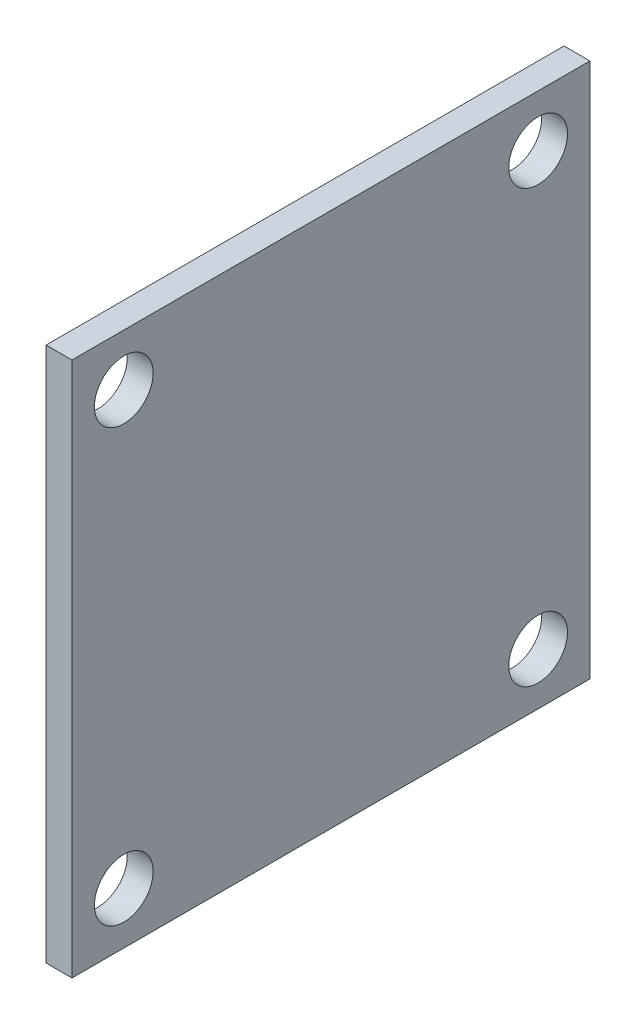
ISO-10303-21;
HEADER;
FILE_DESCRIPTION(('STEP AP214'),'2;1');
FILE_NAME('part.step','',(''),(''),'','','');
FILE_SCHEMA(('AUTOMOTIVE_DESIGN { 1 0 10303 214 1 1 1 1 }'));
ENDSEC;
DATA;
#1=APPLICATION_CONTEXT('core data for automotive mechanical design processes');
#2=APPLICATION_PROTOCOL_DEFINITION('international standard','automotive_design',2000,#1);
#3=PRODUCT_CONTEXT('',#1,'mechanical');
#4=PRODUCT('Part','Part','',(#3));
#5=PRODUCT_RELATED_PRODUCT_CATEGORY('part','',(#4));
#6=PRODUCT_DEFINITION_FORMATION('','',#4);
#7=PRODUCT_DEFINITION_CONTEXT('part definition',#1,'design');
#8=PRODUCT_DEFINITION('design','',#6,#7);
#9=PRODUCT_DEFINITION_SHAPE('','',#8);
#10=(LENGTH_UNIT() NAMED_UNIT(*) SI_UNIT(.MILLI.,.METRE.));
#11=(NAMED_UNIT(*) PLANE_ANGLE_UNIT() SI_UNIT($,.RADIAN.));
#12=(NAMED_UNIT(*) SI_UNIT($,.STERADIAN.) SOLID_ANGLE_UNIT());
#13=UNCERTAINTY_MEASURE_WITH_UNIT(LENGTH_MEASURE(1.E-05),#10,'distance_accuracy_value','');
#14=(GEOMETRIC_REPRESENTATION_CONTEXT(3) GLOBAL_UNCERTAINTY_ASSIGNED_CONTEXT((#13)) GLOBAL_UNIT_ASSIGNED_CONTEXT((#10,
#11,#12)) REPRESENTATION_CONTEXT('',''));
#15=CARTESIAN_POINT('',(0.,0.,0.));
#16=DIRECTION('',(0.,0.,1.));
#17=DIRECTION('',(1.,0.,0.));
#18=AXIS2_PLACEMENT_3D('',#15,#16,#17);
#19=CARTESIAN_POINT('',(-1.5,-15.5,-15.));
#20=DIRECTION('',(0.,0.,-1.));
#21=DIRECTION('',(-1.,0.,0.));
#22=AXIS2_PLACEMENT_3D('',#19,#20,#21);
#23=PLANE('',#22);
#24=DIRECTION('',(0.,1.,0.));
#25=VECTOR('',#24,1.);
#26=CARTESIAN_POINT('',(0.,-15.5,-15.));
#27=LINE('',#26,#25);
#28=CARTESIAN_POINT('',(0.,-15.5,-15.));
#29=VERTEX_POINT('',#28);
#30=CARTESIAN_POINT('',(0.,15.5,-15.));
#31=VERTEX_POINT('',#30);
#32=EDGE_CURVE('E104',#29,#31,#27,.T.);
#33=ORIENTED_EDGE('',*,*,#32,.F.);
#34=DIRECTION('',(1.,0.,0.));
#35=VECTOR('',#34,1.);
#36=CARTESIAN_POINT('',(-1.5,-15.5,-15.));
#37=LINE('',#36,#35);
#38=CARTESIAN_POINT('',(-1.5,-15.5,-15.));
#39=VERTEX_POINT('',#38);
#40=EDGE_CURVE('E11',#39,#29,#37,.T.);
#41=ORIENTED_EDGE('',*,*,#40,.F.);
#42=DIRECTION('',(0.,1.,0.));
#43=VECTOR('',#42,1.);
#44=CARTESIAN_POINT('',(-1.5,-15.5,-15.));
#45=LINE('',#44,#43);
#46=CARTESIAN_POINT('',(-1.5,15.5,-15.));
#47=VERTEX_POINT('',#46);
#48=EDGE_CURVE('E97',#39,#47,#45,.T.);
#49=ORIENTED_EDGE('',*,*,#48,.T.);
#50=DIRECTION('',(1.,0.,0.));
#51=VECTOR('',#50,1.);
#52=CARTESIAN_POINT('',(-1.5,15.5,-15.));
#53=LINE('',#52,#51);
#54=EDGE_CURVE('E42',#47,#31,#53,.T.);
#55=ORIENTED_EDGE('',*,*,#54,.T.);
#56=EDGE_LOOP('',(#33,#41,#49,#55));
#57=FACE_BOUND('',#56,.T.);
#58=ADVANCED_FACE('F39',(#57),#23,.T.);
#59=CARTESIAN_POINT('',(-1.5,-15.5,15.));
#60=DIRECTION('',(0.,-1.,0.));
#61=DIRECTION('',(0.,0.,-1.));
#62=AXIS2_PLACEMENT_3D('',#59,#60,#61);
#63=PLANE('',#62);
#64=DIRECTION('',(0.,0.,-1.));
#65=VECTOR('',#64,1.);
#66=CARTESIAN_POINT('',(0.,-15.5,15.));
#67=LINE('',#66,#65);
#68=CARTESIAN_POINT('',(0.,-15.5,15.));
#69=VERTEX_POINT('',#68);
#70=EDGE_CURVE('E99',#69,#29,#67,.T.);
#71=ORIENTED_EDGE('',*,*,#70,.F.);
#72=DIRECTION('',(1.,0.,0.));
#73=VECTOR('',#72,1.);
#74=CARTESIAN_POINT('',(-1.5,-15.5,15.));
#75=LINE('',#74,#73);
#76=CARTESIAN_POINT('',(-1.5,-15.5,15.));
#77=VERTEX_POINT('',#76);
#78=EDGE_CURVE('E48',#77,#69,#75,.T.);
#79=ORIENTED_EDGE('',*,*,#78,.F.);
#80=DIRECTION('',(0.,0.,-1.));
#81=VECTOR('',#80,1.);
#82=CARTESIAN_POINT('',(-1.5,-15.5,15.));
#83=LINE('',#82,#81);
#84=EDGE_CURVE('E94',#77,#39,#83,.T.);
#85=ORIENTED_EDGE('',*,*,#84,.T.);
#86=ORIENTED_EDGE('',*,*,#40,.T.);
#87=EDGE_LOOP('',(#71,#79,#85,#86));
#88=FACE_BOUND('',#87,.T.);
#89=ADVANCED_FACE('F115',(#88),#63,.T.);
#90=CARTESIAN_POINT('',(-1.5,-15.5,15.));
#91=DIRECTION('',(0.,0.,1.));
#92=DIRECTION('',(1.,0.,0.));
#93=AXIS2_PLACEMENT_3D('',#90,#91,#92);
#94=PLANE('',#93);
#95=DIRECTION('',(0.,-1.,0.));
#96=VECTOR('',#95,1.);
#97=CARTESIAN_POINT('',(0.,-15.5,15.));
#98=LINE('',#97,#96);
#99=CARTESIAN_POINT('',(0.,15.5,15.));
#100=VERTEX_POINT('',#99);
#101=EDGE_CURVE('E89',#100,#69,#98,.T.);
#102=ORIENTED_EDGE('',*,*,#101,.F.);
#103=DIRECTION('',(1.,0.,0.));
#104=VECTOR('',#103,1.);
#105=CARTESIAN_POINT('',(-1.5,15.5,15.));
#106=LINE('',#105,#104);
#107=CARTESIAN_POINT('',(-1.5,15.5,15.));
#108=VERTEX_POINT('',#107);
#109=EDGE_CURVE('E84',#108,#100,#106,.T.);
#110=ORIENTED_EDGE('',*,*,#109,.F.);
#111=DIRECTION('',(0.,-1.,0.));
#112=VECTOR('',#111,1.);
#113=CARTESIAN_POINT('',(-1.5,-15.5,15.));
#114=LINE('',#113,#112);
#115=EDGE_CURVE('E87',#108,#77,#114,.T.);
#116=ORIENTED_EDGE('',*,*,#115,.T.);
#117=ORIENTED_EDGE('',*,*,#78,.T.);
#118=EDGE_LOOP('',(#102,#110,#116,#117));
#119=FACE_BOUND('',#118,.T.);
#120=ADVANCED_FACE('F86',(#119),#94,.T.);
#121=CARTESIAN_POINT('',(-1.5,15.5,15.));
#122=DIRECTION('',(0.,1.,0.));
#123=DIRECTION('',(0.,0.,1.));
#124=AXIS2_PLACEMENT_3D('',#121,#122,#123);
#125=PLANE('',#124);
#126=DIRECTION('',(0.,0.,1.));
#127=VECTOR('',#126,1.);
#128=CARTESIAN_POINT('',(0.,15.5,15.));
#129=LINE('',#128,#127);
#130=EDGE_CURVE('E107',#31,#100,#129,.T.);
#131=ORIENTED_EDGE('',*,*,#130,.F.);
#132=ORIENTED_EDGE('',*,*,#54,.F.);
#133=DIRECTION('',(0.,0.,1.));
#134=VECTOR('',#133,1.);
#135=CARTESIAN_POINT('',(-1.5,15.5,15.));
#136=LINE('',#135,#134);
#137=EDGE_CURVE('E93',#47,#108,#136,.T.);
#138=ORIENTED_EDGE('',*,*,#137,.T.);
#139=ORIENTED_EDGE('',*,*,#109,.T.);
#140=EDGE_LOOP('',(#131,#132,#138,#139));
#141=FACE_BOUND('',#140,.T.);
#142=ADVANCED_FACE('F96',(#141),#125,.T.);
#143=CARTESIAN_POINT('',(-1.5,0.,0.));
#144=DIRECTION('',(-1.,0.,0.));
#145=DIRECTION('',(0.,0.,1.));
#146=AXIS2_PLACEMENT_3D('',#143,#144,#145);
#147=PLANE('',#146);
#148=CARTESIAN_POINT('',(-1.5,12.5,12.));
#149=DIRECTION('',(-1.,0.,0.));
#150=DIRECTION('',(0.,0.,1.));
#151=AXIS2_PLACEMENT_3D('',#148,#149,#150);
#152=CIRCLE('',#151,1.7);
#153=CARTESIAN_POINT('',(-1.5,12.5,13.7));
#154=VERTEX_POINT('',#153);
#155=EDGE_CURVE('E156',#154,#154,#152,.T.);
#156=ORIENTED_EDGE('',*,*,#155,.F.);
#157=EDGE_LOOP('',(#156));
#158=FACE_BOUND('',#157,.T.);
#159=CARTESIAN_POINT('',(-1.5,12.5,-12.));
#160=DIRECTION('',(-1.,0.,0.));
#161=DIRECTION('',(0.,0.,1.));
#162=AXIS2_PLACEMENT_3D('',#159,#160,#161);
#163=CIRCLE('',#162,1.7);
#164=CARTESIAN_POINT('',(-1.5,12.5,-10.3));
#165=VERTEX_POINT('',#164);
#166=EDGE_CURVE('E166',#165,#165,#163,.T.);
#167=ORIENTED_EDGE('',*,*,#166,.F.);
#168=EDGE_LOOP('',(#167));
#169=FACE_BOUND('',#168,.T.);
#170=CARTESIAN_POINT('',(-1.5,-12.5,-12.));
#171=DIRECTION('',(-1.,0.,0.));
#172=DIRECTION('',(0.,0.,1.));
#173=AXIS2_PLACEMENT_3D('',#170,#171,#172);
#174=CIRCLE('',#173,1.7);
#175=CARTESIAN_POINT('',(-1.5,-12.5,-10.3));
#176=VERTEX_POINT('',#175);
#177=EDGE_CURVE('E172',#176,#176,#174,.T.);
#178=ORIENTED_EDGE('',*,*,#177,.F.);
#179=EDGE_LOOP('',(#178));
#180=FACE_BOUND('',#179,.T.);
#181=CARTESIAN_POINT('',(-1.5,-12.5,12.));
#182=DIRECTION('',(-1.,0.,0.));
#183=DIRECTION('',(0.,0.,1.));
#184=AXIS2_PLACEMENT_3D('',#181,#182,#183);
#185=CIRCLE('',#184,1.7);
#186=CARTESIAN_POINT('',(-1.5,-12.5,13.7));
#187=VERTEX_POINT('',#186);
#188=EDGE_CURVE('E108',#187,#187,#185,.T.);
#189=ORIENTED_EDGE('',*,*,#188,.F.);
#190=EDGE_LOOP('',(#189));
#191=FACE_BOUND('',#190,.T.);
#192=ORIENTED_EDGE('',*,*,#48,.F.);
#193=ORIENTED_EDGE('',*,*,#84,.F.);
#194=ORIENTED_EDGE('',*,*,#115,.F.);
#195=ORIENTED_EDGE('',*,*,#137,.F.);
#196=EDGE_LOOP('',(#192,#193,#194,#195));
#197=FACE_BOUND('',#196,.T.);
#198=ADVANCED_FACE('F92',(#158,#169,#180,#191,#197),#147,.T.);
#199=CARTESIAN_POINT('',(0.,0.,0.));
#200=DIRECTION('',(-1.,0.,0.));
#201=DIRECTION('',(0.,0.,1.));
#202=AXIS2_PLACEMENT_3D('',#199,#200,#201);
#203=PLANE('',#202);
#204=CARTESIAN_POINT('',(0.,12.5,12.));
#205=DIRECTION('',(1.,0.,0.));
#206=DIRECTION('',(0.,0.,-1.));
#207=AXIS2_PLACEMENT_3D('',#204,#205,#206);
#208=CIRCLE('',#207,1.7);
#209=CARTESIAN_POINT('',(0.,12.5,10.3));
#210=VERTEX_POINT('',#209);
#211=EDGE_CURVE('E159',#210,#210,#208,.T.);
#212=ORIENTED_EDGE('',*,*,#211,.F.);
#213=EDGE_LOOP('',(#212));
#214=FACE_BOUND('',#213,.T.);
#215=CARTESIAN_POINT('',(0.,12.5,-12.));
#216=DIRECTION('',(1.,0.,0.));
#217=DIRECTION('',(0.,0.,-1.));
#218=AXIS2_PLACEMENT_3D('',#215,#216,#217);
#219=CIRCLE('',#218,1.7);
#220=CARTESIAN_POINT('',(0.,12.5,-13.7));
#221=VERTEX_POINT('',#220);
#222=EDGE_CURVE('E161',#221,#221,#219,.T.);
#223=ORIENTED_EDGE('',*,*,#222,.F.);
#224=EDGE_LOOP('',(#223));
#225=FACE_BOUND('',#224,.T.);
#226=CARTESIAN_POINT('',(0.,-12.5,-12.));
#227=DIRECTION('',(1.,0.,0.));
#228=DIRECTION('',(0.,0.,-1.));
#229=AXIS2_PLACEMENT_3D('',#226,#227,#228);
#230=CIRCLE('',#229,1.7);
#231=CARTESIAN_POINT('',(0.,-12.5,-13.7));
#232=VERTEX_POINT('',#231);
#233=EDGE_CURVE('E169',#232,#232,#230,.T.);
#234=ORIENTED_EDGE('',*,*,#233,.F.);
#235=EDGE_LOOP('',(#234));
#236=FACE_BOUND('',#235,.T.);
#237=CARTESIAN_POINT('',(0.,-12.5,12.));
#238=DIRECTION('',(1.,0.,0.));
#239=DIRECTION('',(0.,0.,-1.));
#240=AXIS2_PLACEMENT_3D('',#237,#238,#239);
#241=CIRCLE('',#240,1.7);
#242=CARTESIAN_POINT('',(0.,-12.5,10.3));
#243=VERTEX_POINT('',#242);
#244=EDGE_CURVE('E175',#243,#243,#241,.T.);
#245=ORIENTED_EDGE('',*,*,#244,.F.);
#246=EDGE_LOOP('',(#245));
#247=FACE_BOUND('',#246,.T.);
#248=ORIENTED_EDGE('',*,*,#32,.T.);
#249=ORIENTED_EDGE('',*,*,#130,.T.);
#250=ORIENTED_EDGE('',*,*,#101,.T.);
#251=ORIENTED_EDGE('',*,*,#70,.T.);
#252=EDGE_LOOP('',(#248,#249,#250,#251));
#253=FACE_BOUND('',#252,.T.);
#254=ADVANCED_FACE('F114',(#214,#225,#236,#247,#253),#203,.F.);
#255=CARTESIAN_POINT('',(0.,-12.5,12.));
#256=DIRECTION('',(1.,0.,0.));
#257=DIRECTION('',(0.,0.,-1.));
#258=AXIS2_PLACEMENT_3D('',#255,#256,#257);
#259=CYLINDRICAL_SURFACE('',#258,1.7);
#260=ORIENTED_EDGE('',*,*,#188,.T.);
#261=EDGE_LOOP('',(#260));
#262=FACE_BOUND('',#261,.T.);
#263=ORIENTED_EDGE('',*,*,#244,.T.);
#264=EDGE_LOOP('',(#263));
#265=FACE_BOUND('',#264,.T.);
#266=ADVANCED_FACE('F133',(#262,#265),#259,.F.);
#267=CARTESIAN_POINT('',(0.,-12.5,-12.));
#268=DIRECTION('',(1.,0.,0.));
#269=DIRECTION('',(0.,0.,-1.));
#270=AXIS2_PLACEMENT_3D('',#267,#268,#269);
#271=CYLINDRICAL_SURFACE('',#270,1.7);
#272=ORIENTED_EDGE('',*,*,#177,.T.);
#273=EDGE_LOOP('',(#272));
#274=FACE_BOUND('',#273,.T.);
#275=ORIENTED_EDGE('',*,*,#233,.T.);
#276=EDGE_LOOP('',(#275));
#277=FACE_BOUND('',#276,.T.);
#278=ADVANCED_FACE('F140',(#274,#277),#271,.F.);
#279=CARTESIAN_POINT('',(0.,12.5,-12.));
#280=DIRECTION('',(1.,0.,0.));
#281=DIRECTION('',(0.,0.,-1.));
#282=AXIS2_PLACEMENT_3D('',#279,#280,#281);
#283=CYLINDRICAL_SURFACE('',#282,1.7);
#284=ORIENTED_EDGE('',*,*,#166,.T.);
#285=EDGE_LOOP('',(#284));
#286=FACE_BOUND('',#285,.T.);
#287=ORIENTED_EDGE('',*,*,#222,.T.);
#288=EDGE_LOOP('',(#287));
#289=FACE_BOUND('',#288,.T.);
#290=ADVANCED_FACE('F144',(#286,#289),#283,.F.);
#291=CARTESIAN_POINT('',(0.,12.5,12.));
#292=DIRECTION('',(1.,0.,0.));
#293=DIRECTION('',(0.,0.,-1.));
#294=AXIS2_PLACEMENT_3D('',#291,#292,#293);
#295=CYLINDRICAL_SURFACE('',#294,1.7);
#296=ORIENTED_EDGE('',*,*,#155,.T.);
#297=EDGE_LOOP('',(#296));
#298=FACE_BOUND('',#297,.T.);
#299=ORIENTED_EDGE('',*,*,#211,.T.);
#300=EDGE_LOOP('',(#299));
#301=FACE_BOUND('',#300,.T.);
#302=ADVANCED_FACE('F148',(#298,#301),#295,.F.);
#303=CLOSED_SHELL('',(#58,#89,#120,#142,#198,#254,#266,#278,#290,#302));
#304=MANIFOLD_SOLID_BREP('B2',#303);
#305=ADVANCED_BREP_SHAPE_REPRESENTATION('',(#18,#304),#14);
#306=SHAPE_DEFINITION_REPRESENTATION(#9,#305);
ENDSEC;
END-ISO-10303-21;
